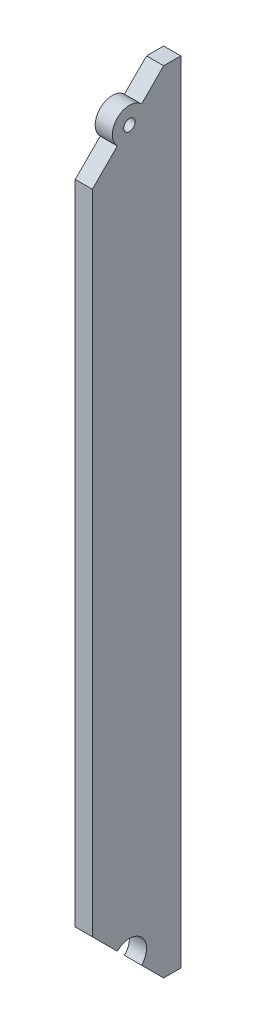
ISO-10303-21;
HEADER;
FILE_DESCRIPTION(('STEP AP214'),'2;1');
FILE_NAME('part.step','',(''),(''),'','','');
FILE_SCHEMA(('AUTOMOTIVE_DESIGN { 1 0 10303 214 1 1 1 1 }'));
ENDSEC;
DATA;
#1=APPLICATION_CONTEXT('core data for automotive mechanical design processes');
#2=APPLICATION_PROTOCOL_DEFINITION('international standard','automotive_design',2000,#1);
#3=PRODUCT_CONTEXT('',#1,'mechanical');
#4=PRODUCT('Part','Part','',(#3));
#5=PRODUCT_RELATED_PRODUCT_CATEGORY('part','',(#4));
#6=PRODUCT_DEFINITION_FORMATION('','',#4);
#7=PRODUCT_DEFINITION_CONTEXT('part definition',#1,'design');
#8=PRODUCT_DEFINITION('design','',#6,#7);
#9=PRODUCT_DEFINITION_SHAPE('','',#8);
#10=(LENGTH_UNIT() NAMED_UNIT(*) SI_UNIT(.MILLI.,.METRE.));
#11=(NAMED_UNIT(*) PLANE_ANGLE_UNIT() SI_UNIT($,.RADIAN.));
#12=(NAMED_UNIT(*) SI_UNIT($,.STERADIAN.) SOLID_ANGLE_UNIT());
#13=UNCERTAINTY_MEASURE_WITH_UNIT(LENGTH_MEASURE(1.E-05),#10,'distance_accuracy_value','');
#14=(GEOMETRIC_REPRESENTATION_CONTEXT(3) GLOBAL_UNCERTAINTY_ASSIGNED_CONTEXT((#13)) GLOBAL_UNIT_ASSIGNED_CONTEXT((#10,
#11,#12)) REPRESENTATION_CONTEXT('',''));
#15=CARTESIAN_POINT('',(0.,0.,0.));
#16=DIRECTION('',(0.,0.,1.));
#17=DIRECTION('',(1.,0.,0.));
#18=AXIS2_PLACEMENT_3D('',#15,#16,#17);
#19=CARTESIAN_POINT('',(6.,0.,0.));
#20=DIRECTION('',(0.,0.707106781186549,-0.707106781186546));
#21=DIRECTION('',(0.,0.707106781186546,0.707106781186549));
#22=AXIS2_PLACEMENT_3D('',#19,#20,#21);
#23=PLANE('',#22);
#24=DIRECTION('',(0.,-0.707106781186546,-0.707106781186549));
#25=VECTOR('',#24,1.);
#26=CARTESIAN_POINT('',(0.,0.,0.));
#27=LINE('',#26,#25);
#28=CARTESIAN_POINT('',(0.,24.9999999999999,25.));
#29=VERTEX_POINT('',#28);
#30=CARTESIAN_POINT('',(0.,16.2426406871193,16.2426406871193));
#31=VERTEX_POINT('',#30);
#32=EDGE_CURVE('E133',#29,#31,#27,.T.);
#33=ORIENTED_EDGE('',*,*,#32,.T.);
#34=DIRECTION('',(1.,0.,0.));
#35=VECTOR('',#34,1.);
#36=CARTESIAN_POINT('',(0.,16.2426406871193,16.2426406871193));
#37=LINE('',#36,#35);
#38=CARTESIAN_POINT('',(6.,16.2426406871193,16.2426406871193));
#39=VERTEX_POINT('',#38);
#40=EDGE_CURVE('E57',#31,#39,#37,.T.);
#41=ORIENTED_EDGE('',*,*,#40,.T.);
#42=DIRECTION('',(0.,-0.707106781186546,-0.707106781186549));
#43=VECTOR('',#42,1.);
#44=CARTESIAN_POINT('',(6.,0.,0.));
#45=LINE('',#44,#43);
#46=CARTESIAN_POINT('',(6.,24.9999999999999,25.));
#47=VERTEX_POINT('',#46);
#48=EDGE_CURVE('E170',#47,#39,#45,.T.);
#49=ORIENTED_EDGE('',*,*,#48,.F.);
#50=DIRECTION('',(-1.,0.,0.));
#51=VECTOR('',#50,1.);
#52=CARTESIAN_POINT('',(6.,24.9999999999999,25.));
#53=LINE('',#52,#51);
#54=EDGE_CURVE('E47',#47,#29,#53,.T.);
#55=ORIENTED_EDGE('',*,*,#54,.T.);
#56=EDGE_LOOP('',(#33,#41,#49,#55));
#57=FACE_BOUND('',#56,.T.);
#58=ADVANCED_FACE('F41',(#57),#23,.F.);
#59=CARTESIAN_POINT('',(6.,138.499999999998,138.5));
#60=DIRECTION('',(0.,0.707106781186543,0.707106781186552));
#61=DIRECTION('',(0.,-0.707106781186552,0.707106781186543));
#62=AXIS2_PLACEMENT_3D('',#59,#60,#61);
#63=PLANE('',#62);
#64=DIRECTION('',(1.,0.,0.));
#65=VECTOR('',#64,1.);
#66=CARTESIAN_POINT('',(-16.9705627484772,260.75735931288,16.2426406871193));
#67=LINE('',#66,#65);
#68=CARTESIAN_POINT('',(0.,260.75735931288,16.2426406871193));
#69=VERTEX_POINT('',#68);
#70=CARTESIAN_POINT('',(6.,260.75735931288,16.2426406871193));
#71=VERTEX_POINT('',#70);
#72=EDGE_CURVE('E138',#69,#71,#67,.T.);
#73=ORIENTED_EDGE('',*,*,#72,.F.);
#74=DIRECTION('',(0.,0.707106781186552,-0.707106781186543));
#75=VECTOR('',#74,1.);
#76=CARTESIAN_POINT('',(0.,138.499999999998,138.5));
#77=LINE('',#76,#75);
#78=CARTESIAN_POINT('',(0.,252.,25.));
#79=VERTEX_POINT('',#78);
#80=EDGE_CURVE('E150',#79,#69,#77,.T.);
#81=ORIENTED_EDGE('',*,*,#80,.F.);
#82=DIRECTION('',(-1.,0.,0.));
#83=VECTOR('',#82,1.);
#84=CARTESIAN_POINT('',(6.,252.,25.));
#85=LINE('',#84,#83);
#86=CARTESIAN_POINT('',(6.,252.,25.));
#87=VERTEX_POINT('',#86);
#88=EDGE_CURVE('E153',#87,#79,#85,.T.);
#89=ORIENTED_EDGE('',*,*,#88,.F.);
#90=DIRECTION('',(0.,0.707106781186552,-0.707106781186543));
#91=VECTOR('',#90,1.);
#92=CARTESIAN_POINT('',(6.,138.499999999998,138.5));
#93=LINE('',#92,#91);
#94=EDGE_CURVE('E157',#87,#71,#93,.T.);
#95=ORIENTED_EDGE('',*,*,#94,.T.);
#96=EDGE_LOOP('',(#73,#81,#89,#95));
#97=FACE_BOUND('',#96,.T.);
#98=ADVANCED_FACE('F180',(#97),#63,.T.);
#99=CARTESIAN_POINT('',(6.,0.,25.));
#100=DIRECTION('',(0.,0.,1.));
#101=DIRECTION('',(0.,-1.,0.));
#102=AXIS2_PLACEMENT_3D('',#99,#100,#101);
#103=PLANE('',#102);
#104=DIRECTION('',(0.,1.,0.));
#105=VECTOR('',#104,1.);
#106=CARTESIAN_POINT('',(0.,0.,25.));
#107=LINE('',#106,#105);
#108=EDGE_CURVE('E139',#29,#79,#107,.T.);
#109=ORIENTED_EDGE('',*,*,#108,.F.);
#110=ORIENTED_EDGE('',*,*,#54,.F.);
#111=DIRECTION('',(0.,1.,0.));
#112=VECTOR('',#111,1.);
#113=CARTESIAN_POINT('',(6.,0.,25.));
#114=LINE('',#113,#112);
#115=EDGE_CURVE('E155',#47,#87,#114,.T.);
#116=ORIENTED_EDGE('',*,*,#115,.T.);
#117=ORIENTED_EDGE('',*,*,#88,.T.);
#118=EDGE_LOOP('',(#109,#110,#116,#117));
#119=FACE_BOUND('',#118,.T.);
#120=ADVANCED_FACE('F43',(#119),#103,.T.);
#121=CARTESIAN_POINT('',(6.,7.7573593128807,7.75735931288073));
#122=VERTEX_POINT('',#121);
#123=CARTESIAN_POINT('',(6.,0.,0.));
#124=VERTEX_POINT('',#123);
#125=EDGE_CURVE('E130',#122,#124,#45,.T.);
#126=ORIENTED_EDGE('',*,*,#125,.F.);
#127=DIRECTION('',(1.,0.,0.));
#128=VECTOR('',#127,1.);
#129=CARTESIAN_POINT('',(0.,7.7573593128807,7.75735931288073));
#130=LINE('',#129,#128);
#131=CARTESIAN_POINT('',(0.,7.7573593128807,7.75735931288073));
#132=VERTEX_POINT('',#131);
#133=EDGE_CURVE('E116',#122,#132,#130,.F.);
#134=ORIENTED_EDGE('',*,*,#133,.T.);
#135=CARTESIAN_POINT('',(0.,0.,0.));
#136=VERTEX_POINT('',#135);
#137=EDGE_CURVE('E124',#132,#136,#27,.T.);
#138=ORIENTED_EDGE('',*,*,#137,.T.);
#139=DIRECTION('',(-1.,0.,0.));
#140=VECTOR('',#139,1.);
#141=CARTESIAN_POINT('',(6.,0.,0.));
#142=LINE('',#141,#140);
#143=EDGE_CURVE('E165',#124,#136,#142,.T.);
#144=ORIENTED_EDGE('',*,*,#143,.F.);
#145=EDGE_LOOP('',(#126,#134,#138,#144));
#146=FACE_BOUND('',#145,.T.);
#147=ADVANCED_FACE('F123',(#146),#23,.F.);
#148=CARTESIAN_POINT('',(6.,0.,0.));
#149=DIRECTION('',(0.,-1.,0.));
#150=DIRECTION('',(0.,0.,-1.));
#151=AXIS2_PLACEMENT_3D('',#148,#149,#150);
#152=PLANE('',#151);
#153=DIRECTION('',(0.,0.,1.));
#154=VECTOR('',#153,1.);
#155=CARTESIAN_POINT('',(0.,0.,0.));
#156=LINE('',#155,#154);
#157=CARTESIAN_POINT('',(0.,0.,-6.00000000000003));
#158=VERTEX_POINT('',#157);
#159=EDGE_CURVE('E131',#158,#136,#156,.T.);
#160=ORIENTED_EDGE('',*,*,#159,.F.);
#161=DIRECTION('',(-1.,0.,0.));
#162=VECTOR('',#161,1.);
#163=CARTESIAN_POINT('',(6.,0.,-6.00000000000003));
#164=LINE('',#163,#162);
#165=CARTESIAN_POINT('',(6.,0.,-6.00000000000003));
#166=VERTEX_POINT('',#165);
#167=EDGE_CURVE('E164',#166,#158,#164,.T.);
#168=ORIENTED_EDGE('',*,*,#167,.F.);
#169=DIRECTION('',(0.,0.,1.));
#170=VECTOR('',#169,1.);
#171=CARTESIAN_POINT('',(6.,0.,0.));
#172=LINE('',#171,#170);
#173=EDGE_CURVE('E190',#166,#124,#172,.T.);
#174=ORIENTED_EDGE('',*,*,#173,.T.);
#175=ORIENTED_EDGE('',*,*,#143,.T.);
#176=EDGE_LOOP('',(#160,#168,#174,#175));
#177=FACE_BOUND('',#176,.T.);
#178=ADVANCED_FACE('F213',(#177),#152,.T.);
#179=CARTESIAN_POINT('',(6.,0.,-6.00000000000003));
#180=DIRECTION('',(0.,0.,-1.));
#181=DIRECTION('',(0.,1.,0.));
#182=AXIS2_PLACEMENT_3D('',#179,#180,#181);
#183=PLANE('',#182);
#184=DIRECTION('',(0.,-1.,0.));
#185=VECTOR('',#184,1.);
#186=CARTESIAN_POINT('',(0.,0.,-6.00000000000003));
#187=LINE('',#186,#185);
#188=CARTESIAN_POINT('',(0.,277.,-6.));
#189=VERTEX_POINT('',#188);
#190=EDGE_CURVE('E143',#189,#158,#187,.T.);
#191=ORIENTED_EDGE('',*,*,#190,.F.);
#192=DIRECTION('',(-1.,0.,0.));
#193=VECTOR('',#192,1.);
#194=CARTESIAN_POINT('',(6.,277.,-6.));
#195=LINE('',#194,#193);
#196=CARTESIAN_POINT('',(6.,277.,-6.));
#197=VERTEX_POINT('',#196);
#198=EDGE_CURVE('E159',#197,#189,#195,.T.);
#199=ORIENTED_EDGE('',*,*,#198,.F.);
#200=DIRECTION('',(0.,-1.,0.));
#201=VECTOR('',#200,1.);
#202=CARTESIAN_POINT('',(6.,0.,-6.00000000000003));
#203=LINE('',#202,#201);
#204=EDGE_CURVE('E187',#197,#166,#203,.T.);
#205=ORIENTED_EDGE('',*,*,#204,.T.);
#206=ORIENTED_EDGE('',*,*,#167,.T.);
#207=EDGE_LOOP('',(#191,#199,#205,#206));
#208=FACE_BOUND('',#207,.T.);
#209=ADVANCED_FACE('F211',(#208),#183,.T.);
#210=CARTESIAN_POINT('',(6.,277.,0.));
#211=DIRECTION('',(0.,1.,0.));
#212=DIRECTION('',(0.,0.,1.));
#213=AXIS2_PLACEMENT_3D('',#210,#211,#212);
#214=PLANE('',#213);
#215=DIRECTION('',(0.,0.,-1.));
#216=VECTOR('',#215,1.);
#217=CARTESIAN_POINT('',(0.,277.,0.));
#218=LINE('',#217,#216);
#219=CARTESIAN_POINT('',(0.,277.,0.));
#220=VERTEX_POINT('',#219);
#221=EDGE_CURVE('E146',#220,#189,#218,.T.);
#222=ORIENTED_EDGE('',*,*,#221,.F.);
#223=DIRECTION('',(-1.,0.,0.));
#224=VECTOR('',#223,1.);
#225=CARTESIAN_POINT('',(6.,277.,0.));
#226=LINE('',#225,#224);
#227=CARTESIAN_POINT('',(6.,277.,0.));
#228=VERTEX_POINT('',#227);
#229=EDGE_CURVE('E154',#228,#220,#226,.T.);
#230=ORIENTED_EDGE('',*,*,#229,.F.);
#231=DIRECTION('',(0.,0.,-1.));
#232=VECTOR('',#231,1.);
#233=CARTESIAN_POINT('',(6.,277.,0.));
#234=LINE('',#233,#232);
#235=EDGE_CURVE('E193',#228,#197,#234,.T.);
#236=ORIENTED_EDGE('',*,*,#235,.T.);
#237=ORIENTED_EDGE('',*,*,#198,.T.);
#238=EDGE_LOOP('',(#222,#230,#236,#237));
#239=FACE_BOUND('',#238,.T.);
#240=ADVANCED_FACE('F207',(#239),#214,.T.);
#241=DIRECTION('',(1.,0.,0.));
#242=VECTOR('',#241,1.);
#243=CARTESIAN_POINT('',(-16.9705627484772,269.242640687119,7.75735931288082));
#244=LINE('',#243,#242);
#245=CARTESIAN_POINT('',(6.,269.242640687119,7.75735931288081));
#246=VERTEX_POINT('',#245);
#247=CARTESIAN_POINT('',(0.,269.242640687119,7.75735931288082));
#248=VERTEX_POINT('',#247);
#249=EDGE_CURVE('E179',#246,#248,#244,.F.);
#250=ORIENTED_EDGE('',*,*,#249,.F.);
#251=EDGE_CURVE('E194',#246,#228,#93,.T.);
#252=ORIENTED_EDGE('',*,*,#251,.T.);
#253=ORIENTED_EDGE('',*,*,#229,.T.);
#254=EDGE_CURVE('E148',#248,#220,#77,.T.);
#255=ORIENTED_EDGE('',*,*,#254,.F.);
#256=EDGE_LOOP('',(#250,#252,#253,#255));
#257=FACE_BOUND('',#256,.T.);
#258=ADVANCED_FACE('F199',(#257),#63,.T.);
#259=CARTESIAN_POINT('',(6.,0.,0.));
#260=DIRECTION('',(1.,0.,0.));
#261=DIRECTION('',(0.,0.,-1.));
#262=AXIS2_PLACEMENT_3D('',#259,#260,#261);
#263=PLANE('',#262);
#264=CARTESIAN_POINT('',(6.,265.,12.));
#265=DIRECTION('',(1.,0.,0.));
#266=DIRECTION('',(0.,0.,-1.));
#267=AXIS2_PLACEMENT_3D('',#264,#265,#266);
#268=CIRCLE('',#267,2.);
#269=CARTESIAN_POINT('',(6.,265.,10.));
#270=VERTEX_POINT('',#269);
#271=EDGE_CURVE('E336',#270,#270,#268,.T.);
#272=ORIENTED_EDGE('',*,*,#271,.F.);
#273=EDGE_LOOP('',(#272));
#274=FACE_BOUND('',#273,.T.);
#275=CARTESIAN_POINT('',(6.,12.,12.));
#276=DIRECTION('',(1.,0.,0.));
#277=DIRECTION('',(0.,0.,-1.));
#278=AXIS2_PLACEMENT_3D('',#275,#276,#277);
#279=CIRCLE('',#278,6.);
#280=EDGE_CURVE('E338',#122,#39,#279,.T.);
#281=ORIENTED_EDGE('',*,*,#280,.F.);
#282=ORIENTED_EDGE('',*,*,#125,.T.);
#283=ORIENTED_EDGE('',*,*,#173,.F.);
#284=ORIENTED_EDGE('',*,*,#204,.F.);
#285=ORIENTED_EDGE('',*,*,#235,.F.);
#286=ORIENTED_EDGE('',*,*,#251,.F.);
#287=CARTESIAN_POINT('',(6.,265.,12.));
#288=DIRECTION('',(1.,0.,0.));
#289=DIRECTION('',(0.,0.,-1.));
#290=AXIS2_PLACEMENT_3D('',#287,#288,#289);
#291=CIRCLE('',#290,6.);
#292=EDGE_CURVE('E332',#246,#71,#291,.T.);
#293=ORIENTED_EDGE('',*,*,#292,.T.);
#294=ORIENTED_EDGE('',*,*,#94,.F.);
#295=ORIENTED_EDGE('',*,*,#115,.F.);
#296=ORIENTED_EDGE('',*,*,#48,.T.);
#297=EDGE_LOOP('',(#281,#282,#283,#284,#285,#286,#293,#294,#295,#296));
#298=FACE_BOUND('',#297,.T.);
#299=ADVANCED_FACE('F209',(#274,#298),#263,.T.);
#300=CARTESIAN_POINT('',(0.,0.,0.));
#301=DIRECTION('',(1.,0.,0.));
#302=DIRECTION('',(0.,0.,-1.));
#303=AXIS2_PLACEMENT_3D('',#300,#301,#302);
#304=PLANE('',#303);
#305=CARTESIAN_POINT('',(0.,265.,12.));
#306=DIRECTION('',(1.,0.,0.));
#307=DIRECTION('',(0.,0.,-1.));
#308=AXIS2_PLACEMENT_3D('',#305,#306,#307);
#309=CIRCLE('',#308,2.);
#310=CARTESIAN_POINT('',(0.,265.,10.));
#311=VERTEX_POINT('',#310);
#312=EDGE_CURVE('E127',#311,#311,#309,.T.);
#313=ORIENTED_EDGE('',*,*,#312,.T.);
#314=EDGE_LOOP('',(#313));
#315=FACE_BOUND('',#314,.T.);
#316=ORIENTED_EDGE('',*,*,#137,.F.);
#317=CARTESIAN_POINT('',(0.,12.,12.));
#318=DIRECTION('',(1.,0.,0.));
#319=DIRECTION('',(0.,0.,-1.));
#320=AXIS2_PLACEMENT_3D('',#317,#318,#319);
#321=CIRCLE('',#320,6.);
#322=EDGE_CURVE('E11',#132,#31,#321,.T.);
#323=ORIENTED_EDGE('',*,*,#322,.T.);
#324=ORIENTED_EDGE('',*,*,#32,.F.);
#325=ORIENTED_EDGE('',*,*,#108,.T.);
#326=ORIENTED_EDGE('',*,*,#80,.T.);
#327=CARTESIAN_POINT('',(0.,265.,12.));
#328=DIRECTION('',(1.,0.,0.));
#329=DIRECTION('',(0.,0.,-1.));
#330=AXIS2_PLACEMENT_3D('',#327,#328,#329);
#331=CIRCLE('',#330,6.);
#332=EDGE_CURVE('E65',#69,#248,#331,.F.);
#333=ORIENTED_EDGE('',*,*,#332,.T.);
#334=ORIENTED_EDGE('',*,*,#254,.T.);
#335=ORIENTED_EDGE('',*,*,#221,.T.);
#336=ORIENTED_EDGE('',*,*,#190,.T.);
#337=ORIENTED_EDGE('',*,*,#159,.T.);
#338=EDGE_LOOP('',(#316,#323,#324,#325,#326,#333,#334,#335,#336,#337));
#339=FACE_BOUND('',#338,.T.);
#340=ADVANCED_FACE('F132',(#315,#339),#304,.F.);
#341=CARTESIAN_POINT('',(-16.9705627484772,265.,12.));
#342=DIRECTION('',(1.,0.,0.));
#343=DIRECTION('',(0.,0.,-1.));
#344=AXIS2_PLACEMENT_3D('',#341,#342,#343);
#345=CYLINDRICAL_SURFACE('',#344,6.);
#346=ORIENTED_EDGE('',*,*,#332,.F.);
#347=ORIENTED_EDGE('',*,*,#72,.T.);
#348=ORIENTED_EDGE('',*,*,#292,.F.);
#349=ORIENTED_EDGE('',*,*,#249,.T.);
#350=EDGE_LOOP('',(#346,#347,#348,#349));
#351=FACE_BOUND('',#350,.T.);
#352=ADVANCED_FACE('F280',(#351),#345,.T.);
#353=CARTESIAN_POINT('',(0.,12.,12.));
#354=DIRECTION('',(1.,0.,0.));
#355=DIRECTION('',(0.,0.,-1.));
#356=AXIS2_PLACEMENT_3D('',#353,#354,#355);
#357=CYLINDRICAL_SURFACE('',#356,6.);
#358=ORIENTED_EDGE('',*,*,#322,.F.);
#359=ORIENTED_EDGE('',*,*,#133,.F.);
#360=ORIENTED_EDGE('',*,*,#280,.T.);
#361=ORIENTED_EDGE('',*,*,#40,.F.);
#362=EDGE_LOOP('',(#358,#359,#360,#361));
#363=FACE_BOUND('',#362,.T.);
#364=ADVANCED_FACE('F112',(#363),#357,.F.);
#365=CARTESIAN_POINT('',(0.,265.,12.));
#366=DIRECTION('',(1.,0.,0.));
#367=DIRECTION('',(0.,0.,-1.));
#368=AXIS2_PLACEMENT_3D('',#365,#366,#367);
#369=CYLINDRICAL_SURFACE('',#368,2.);
#370=ORIENTED_EDGE('',*,*,#312,.F.);
#371=EDGE_LOOP('',(#370));
#372=FACE_BOUND('',#371,.T.);
#373=ORIENTED_EDGE('',*,*,#271,.T.);
#374=EDGE_LOOP('',(#373));
#375=FACE_BOUND('',#374,.T.);
#376=ADVANCED_FACE('F289',(#372,#375),#369,.F.);
#377=CLOSED_SHELL('',(#58,#98,#120,#147,#178,#209,#240,#258,#299,#340,#352,#364,#376));
#378=MANIFOLD_SOLID_BREP('B2',#377);
#379=ADVANCED_BREP_SHAPE_REPRESENTATION('',(#18,#378),#14);
#380=SHAPE_DEFINITION_REPRESENTATION(#9,#379);
ENDSEC;
END-ISO-10303-21;
